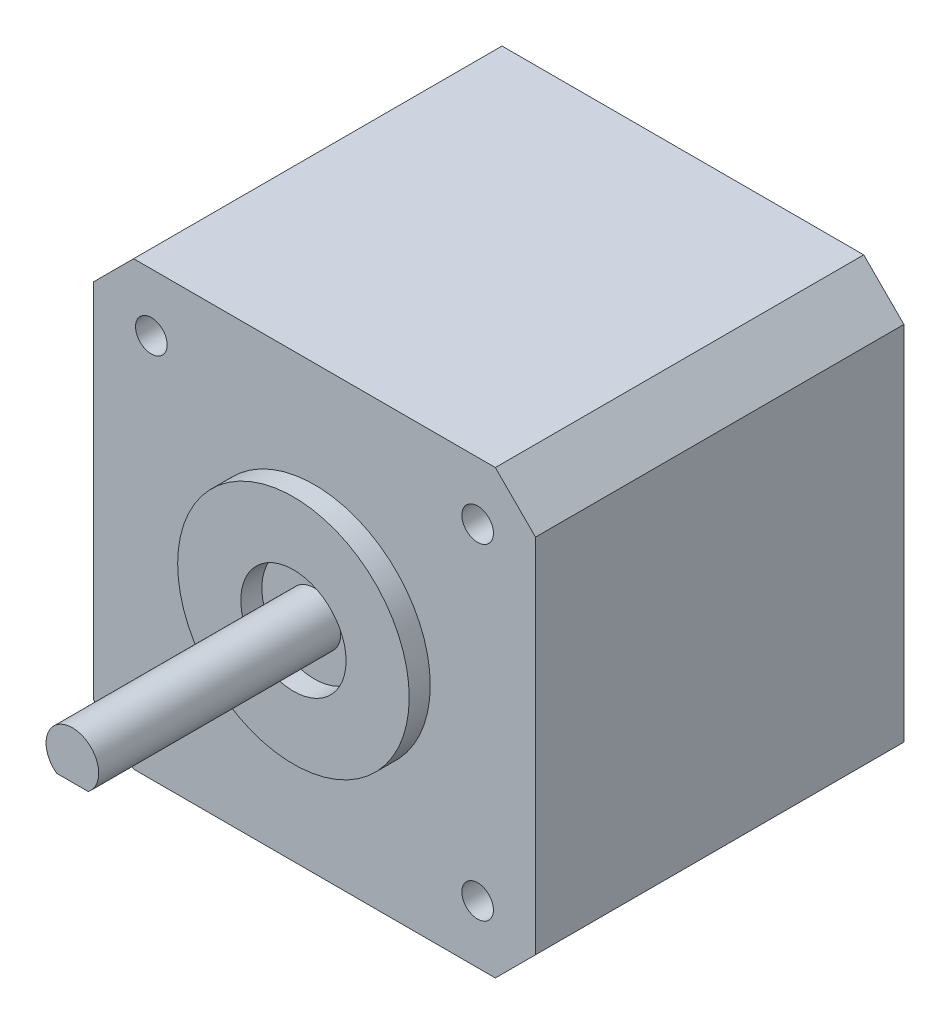
ISO-10303-21;
HEADER;
FILE_DESCRIPTION(('STEP AP214'),'2;1');
FILE_NAME('part.step','',(''),(''),'','','');
FILE_SCHEMA(('AUTOMOTIVE_DESIGN { 1 0 10303 214 1 1 1 1 }'));
ENDSEC;
DATA;
#1=APPLICATION_CONTEXT('core data for automotive mechanical design processes');
#2=APPLICATION_PROTOCOL_DEFINITION('international standard','automotive_design',2000,#1);
#3=PRODUCT_CONTEXT('',#1,'mechanical');
#4=PRODUCT('Part','Part','',(#3));
#5=PRODUCT_RELATED_PRODUCT_CATEGORY('part','',(#4));
#6=PRODUCT_DEFINITION_FORMATION('','',#4);
#7=PRODUCT_DEFINITION_CONTEXT('part definition',#1,'design');
#8=PRODUCT_DEFINITION('design','',#6,#7);
#9=PRODUCT_DEFINITION_SHAPE('','',#8);
#10=(LENGTH_UNIT() NAMED_UNIT(*) SI_UNIT(.MILLI.,.METRE.));
#11=(NAMED_UNIT(*) PLANE_ANGLE_UNIT() SI_UNIT($,.RADIAN.));
#12=(NAMED_UNIT(*) SI_UNIT($,.STERADIAN.) SOLID_ANGLE_UNIT());
#13=UNCERTAINTY_MEASURE_WITH_UNIT(LENGTH_MEASURE(1.E-05),#10,'distance_accuracy_value','');
#14=(GEOMETRIC_REPRESENTATION_CONTEXT(3) GLOBAL_UNCERTAINTY_ASSIGNED_CONTEXT((#13)) GLOBAL_UNIT_ASSIGNED_CONTEXT((#10,
#11,#12)) REPRESENTATION_CONTEXT('',''));
#15=CARTESIAN_POINT('',(0.,0.,0.));
#16=DIRECTION('',(0.,0.,1.));
#17=DIRECTION('',(1.,0.,0.));
#18=AXIS2_PLACEMENT_3D('',#15,#16,#17);
#19=CARTESIAN_POINT('',(21.,17.1837661840736,35.));
#20=DIRECTION('',(-0.70710678118655,-0.707106781186545,0.));
#21=DIRECTION('',(0.707106781186545,-0.70710678118655,0.));
#22=AXIS2_PLACEMENT_3D('',#19,#20,#21);
#23=PLANE('',#22);
#24=DIRECTION('',(-0.707106781186545,0.70710678118655,0.));
#25=VECTOR('',#24,1.);
#26=CARTESIAN_POINT('',(21.,17.1837661840736,0.));
#27=LINE('',#26,#25);
#28=CARTESIAN_POINT('',(21.,17.1837661840736,0.));
#29=VERTEX_POINT('',#28);
#30=CARTESIAN_POINT('',(17.1837661840736,21.,0.));
#31=VERTEX_POINT('',#30);
#32=EDGE_CURVE('E153',#29,#31,#27,.T.);
#33=ORIENTED_EDGE('',*,*,#32,.T.);
#34=DIRECTION('',(0.,0.,-1.));
#35=VECTOR('',#34,1.);
#36=CARTESIAN_POINT('',(17.1837661840736,21.,35.));
#37=LINE('',#36,#35);
#38=CARTESIAN_POINT('',(17.1837661840736,21.,35.));
#39=VERTEX_POINT('',#38);
#40=EDGE_CURVE('E196',#39,#31,#37,.T.);
#41=ORIENTED_EDGE('',*,*,#40,.F.);
#42=DIRECTION('',(-0.707106781186545,0.70710678118655,0.));
#43=VECTOR('',#42,1.);
#44=CARTESIAN_POINT('',(21.,17.1837661840736,35.));
#45=LINE('',#44,#43);
#46=CARTESIAN_POINT('',(21.,17.1837661840736,35.));
#47=VERTEX_POINT('',#46);
#48=EDGE_CURVE('E177',#47,#39,#45,.T.);
#49=ORIENTED_EDGE('',*,*,#48,.F.);
#50=DIRECTION('',(0.,0.,-1.));
#51=VECTOR('',#50,1.);
#52=CARTESIAN_POINT('',(21.,17.1837661840736,35.));
#53=LINE('',#52,#51);
#54=EDGE_CURVE('E149',#47,#29,#53,.T.);
#55=ORIENTED_EDGE('',*,*,#54,.T.);
#56=EDGE_LOOP('',(#33,#41,#49,#55));
#57=FACE_BOUND('',#56,.T.);
#58=ADVANCED_FACE('F39',(#57),#23,.F.);
#59=CARTESIAN_POINT('',(-17.1837661840736,21.,35.));
#60=DIRECTION('',(0.,-1.,0.));
#61=DIRECTION('',(1.,0.,0.));
#62=AXIS2_PLACEMENT_3D('',#59,#60,#61);
#63=PLANE('',#62);
#64=DIRECTION('',(-1.,0.,0.));
#65=VECTOR('',#64,1.);
#66=CARTESIAN_POINT('',(-17.1837661840736,21.,0.));
#67=LINE('',#66,#65);
#68=CARTESIAN_POINT('',(-17.1837661840736,21.,0.));
#69=VERTEX_POINT('',#68);
#70=EDGE_CURVE('E157',#31,#69,#67,.T.);
#71=ORIENTED_EDGE('',*,*,#70,.T.);
#72=DIRECTION('',(0.,0.,-1.));
#73=VECTOR('',#72,1.);
#74=CARTESIAN_POINT('',(-17.1837661840736,21.,35.));
#75=LINE('',#74,#73);
#76=CARTESIAN_POINT('',(-17.1837661840736,21.,35.));
#77=VERTEX_POINT('',#76);
#78=EDGE_CURVE('E192',#77,#69,#75,.T.);
#79=ORIENTED_EDGE('',*,*,#78,.F.);
#80=DIRECTION('',(-1.,0.,0.));
#81=VECTOR('',#80,1.);
#82=CARTESIAN_POINT('',(-17.1837661840736,21.,35.));
#83=LINE('',#82,#81);
#84=EDGE_CURVE('E105',#39,#77,#83,.T.);
#85=ORIENTED_EDGE('',*,*,#84,.F.);
#86=ORIENTED_EDGE('',*,*,#40,.T.);
#87=EDGE_LOOP('',(#71,#79,#85,#86));
#88=FACE_BOUND('',#87,.T.);
#89=ADVANCED_FACE('F228',(#88),#63,.F.);
#90=CARTESIAN_POINT('',(-21.,17.1837661840736,35.));
#91=DIRECTION('',(0.707106781186549,-0.707106781186546,0.));
#92=DIRECTION('',(0.707106781186546,0.707106781186549,0.));
#93=AXIS2_PLACEMENT_3D('',#90,#91,#92);
#94=PLANE('',#93);
#95=DIRECTION('',(-0.707106781186546,-0.707106781186549,0.));
#96=VECTOR('',#95,1.);
#97=CARTESIAN_POINT('',(-21.,17.1837661840736,0.));
#98=LINE('',#97,#96);
#99=CARTESIAN_POINT('',(-21.,17.1837661840736,0.));
#100=VERTEX_POINT('',#99);
#101=EDGE_CURVE('E161',#69,#100,#98,.T.);
#102=ORIENTED_EDGE('',*,*,#101,.T.);
#103=DIRECTION('',(0.,0.,-1.));
#104=VECTOR('',#103,1.);
#105=CARTESIAN_POINT('',(-21.,17.1837661840736,35.));
#106=LINE('',#105,#104);
#107=CARTESIAN_POINT('',(-21.,17.1837661840736,35.));
#108=VERTEX_POINT('',#107);
#109=EDGE_CURVE('E188',#108,#100,#106,.T.);
#110=ORIENTED_EDGE('',*,*,#109,.F.);
#111=DIRECTION('',(-0.707106781186546,-0.707106781186549,0.));
#112=VECTOR('',#111,1.);
#113=CARTESIAN_POINT('',(-21.,17.1837661840736,35.));
#114=LINE('',#113,#112);
#115=EDGE_CURVE('E242',#77,#108,#114,.T.);
#116=ORIENTED_EDGE('',*,*,#115,.F.);
#117=ORIENTED_EDGE('',*,*,#78,.T.);
#118=EDGE_LOOP('',(#102,#110,#116,#117));
#119=FACE_BOUND('',#118,.T.);
#120=ADVANCED_FACE('F233',(#119),#94,.F.);
#121=CARTESIAN_POINT('',(-21.,17.1837661840736,35.));
#122=DIRECTION('',(1.,0.,0.));
#123=DIRECTION('',(0.,1.,0.));
#124=AXIS2_PLACEMENT_3D('',#121,#122,#123);
#125=PLANE('',#124);
#126=DIRECTION('',(0.,-1.,0.));
#127=VECTOR('',#126,1.);
#128=CARTESIAN_POINT('',(-21.,17.1837661840736,0.));
#129=LINE('',#128,#127);
#130=CARTESIAN_POINT('',(-21.,-17.1837661840736,0.));
#131=VERTEX_POINT('',#130);
#132=EDGE_CURVE('E164',#100,#131,#129,.T.);
#133=ORIENTED_EDGE('',*,*,#132,.T.);
#134=DIRECTION('',(0.,0.,-1.));
#135=VECTOR('',#134,1.);
#136=CARTESIAN_POINT('',(-21.,-17.1837661840736,35.));
#137=LINE('',#136,#135);
#138=CARTESIAN_POINT('',(-21.,-17.1837661840736,35.));
#139=VERTEX_POINT('',#138);
#140=EDGE_CURVE('E184',#139,#131,#137,.T.);
#141=ORIENTED_EDGE('',*,*,#140,.F.);
#142=DIRECTION('',(0.,-1.,0.));
#143=VECTOR('',#142,1.);
#144=CARTESIAN_POINT('',(-21.,17.1837661840736,35.));
#145=LINE('',#144,#143);
#146=EDGE_CURVE('E245',#108,#139,#145,.T.);
#147=ORIENTED_EDGE('',*,*,#146,.F.);
#148=ORIENTED_EDGE('',*,*,#109,.T.);
#149=EDGE_LOOP('',(#133,#141,#147,#148));
#150=FACE_BOUND('',#149,.T.);
#151=ADVANCED_FACE('F520',(#150),#125,.F.);
#152=CARTESIAN_POINT('',(-17.1837661840736,-21.,35.));
#153=DIRECTION('',(0.707106781186548,0.707106781186548,0.));
#154=DIRECTION('',(-0.707106781186548,0.707106781186548,0.));
#155=AXIS2_PLACEMENT_3D('',#152,#153,#154);
#156=PLANE('',#155);
#157=DIRECTION('',(0.707106781186548,-0.707106781186548,0.));
#158=VECTOR('',#157,1.);
#159=CARTESIAN_POINT('',(-17.1837661840736,-21.,0.));
#160=LINE('',#159,#158);
#161=CARTESIAN_POINT('',(-17.1837661840736,-21.,0.));
#162=VERTEX_POINT('',#161);
#163=EDGE_CURVE('E167',#131,#162,#160,.T.);
#164=ORIENTED_EDGE('',*,*,#163,.T.);
#165=DIRECTION('',(0.,0.,-1.));
#166=VECTOR('',#165,1.);
#167=CARTESIAN_POINT('',(-17.1837661840736,-21.,35.));
#168=LINE('',#167,#166);
#169=CARTESIAN_POINT('',(-17.1837661840736,-21.,35.));
#170=VERTEX_POINT('',#169);
#171=EDGE_CURVE('E142',#170,#162,#168,.T.);
#172=ORIENTED_EDGE('',*,*,#171,.F.);
#173=DIRECTION('',(0.707106781186548,-0.707106781186548,0.));
#174=VECTOR('',#173,1.);
#175=CARTESIAN_POINT('',(-17.1837661840736,-21.,35.));
#176=LINE('',#175,#174);
#177=EDGE_CURVE('E128',#139,#170,#176,.T.);
#178=ORIENTED_EDGE('',*,*,#177,.F.);
#179=ORIENTED_EDGE('',*,*,#140,.T.);
#180=EDGE_LOOP('',(#164,#172,#178,#179));
#181=FACE_BOUND('',#180,.T.);
#182=ADVANCED_FACE('F512',(#181),#156,.F.);
#183=CARTESIAN_POINT('',(17.1837661840735,-21.,35.));
#184=DIRECTION('',(0.,1.,0.));
#185=DIRECTION('',(-1.,0.,0.));
#186=AXIS2_PLACEMENT_3D('',#183,#184,#185);
#187=PLANE('',#186);
#188=DIRECTION('',(1.,0.,0.));
#189=VECTOR('',#188,1.);
#190=CARTESIAN_POINT('',(17.1837661840735,-21.,0.));
#191=LINE('',#190,#189);
#192=CARTESIAN_POINT('',(17.1837661840735,-21.,0.));
#193=VERTEX_POINT('',#192);
#194=EDGE_CURVE('E138',#162,#193,#191,.T.);
#195=ORIENTED_EDGE('',*,*,#194,.T.);
#196=DIRECTION('',(0.,0.,-1.));
#197=VECTOR('',#196,1.);
#198=CARTESIAN_POINT('',(17.1837661840735,-21.,35.));
#199=LINE('',#198,#197);
#200=CARTESIAN_POINT('',(17.1837661840735,-21.,35.));
#201=VERTEX_POINT('',#200);
#202=EDGE_CURVE('E135',#201,#193,#199,.T.);
#203=ORIENTED_EDGE('',*,*,#202,.F.);
#204=DIRECTION('',(1.,0.,0.));
#205=VECTOR('',#204,1.);
#206=CARTESIAN_POINT('',(17.1837661840735,-21.,35.));
#207=LINE('',#206,#205);
#208=EDGE_CURVE('E121',#170,#201,#207,.T.);
#209=ORIENTED_EDGE('',*,*,#208,.F.);
#210=ORIENTED_EDGE('',*,*,#171,.T.);
#211=EDGE_LOOP('',(#195,#203,#209,#210));
#212=FACE_BOUND('',#211,.T.);
#213=ADVANCED_FACE('F136',(#212),#187,.F.);
#214=CARTESIAN_POINT('',(17.1837661840735,-21.,35.));
#215=DIRECTION('',(-0.707106781186546,0.707106781186549,0.));
#216=DIRECTION('',(-0.707106781186549,-0.707106781186546,0.));
#217=AXIS2_PLACEMENT_3D('',#214,#215,#216);
#218=PLANE('',#217);
#219=DIRECTION('',(0.707106781186549,0.707106781186546,0.));
#220=VECTOR('',#219,1.);
#221=CARTESIAN_POINT('',(17.1837661840735,-21.,0.));
#222=LINE('',#221,#220);
#223=CARTESIAN_POINT('',(21.,-17.1837661840735,0.));
#224=VERTEX_POINT('',#223);
#225=EDGE_CURVE('E172',#193,#224,#222,.T.);
#226=ORIENTED_EDGE('',*,*,#225,.T.);
#227=DIRECTION('',(0.,0.,-1.));
#228=VECTOR('',#227,1.);
#229=CARTESIAN_POINT('',(21.,-17.1837661840735,35.));
#230=LINE('',#229,#228);
#231=CARTESIAN_POINT('',(21.,-17.1837661840735,35.));
#232=VERTEX_POINT('',#231);
#233=EDGE_CURVE('E143',#232,#224,#230,.T.);
#234=ORIENTED_EDGE('',*,*,#233,.F.);
#235=DIRECTION('',(0.707106781186549,0.707106781186546,0.));
#236=VECTOR('',#235,1.);
#237=CARTESIAN_POINT('',(17.1837661840735,-21.,35.));
#238=LINE('',#237,#236);
#239=EDGE_CURVE('E125',#201,#232,#238,.T.);
#240=ORIENTED_EDGE('',*,*,#239,.F.);
#241=ORIENTED_EDGE('',*,*,#202,.T.);
#242=EDGE_LOOP('',(#226,#234,#240,#241));
#243=FACE_BOUND('',#242,.T.);
#244=ADVANCED_FACE('F145',(#243),#218,.F.);
#245=CARTESIAN_POINT('',(21.,-17.1837661840735,35.));
#246=DIRECTION('',(-1.,0.,0.));
#247=DIRECTION('',(0.,-1.,0.));
#248=AXIS2_PLACEMENT_3D('',#245,#246,#247);
#249=PLANE('',#248);
#250=DIRECTION('',(0.,1.,0.));
#251=VECTOR('',#250,1.);
#252=CARTESIAN_POINT('',(21.,-17.1837661840735,0.));
#253=LINE('',#252,#251);
#254=EDGE_CURVE('E96',#224,#29,#253,.T.);
#255=ORIENTED_EDGE('',*,*,#254,.T.);
#256=ORIENTED_EDGE('',*,*,#54,.F.);
#257=DIRECTION('',(0.,1.,0.));
#258=VECTOR('',#257,1.);
#259=CARTESIAN_POINT('',(21.,-17.1837661840735,35.));
#260=LINE('',#259,#258);
#261=EDGE_CURVE('E63',#232,#47,#260,.T.);
#262=ORIENTED_EDGE('',*,*,#261,.F.);
#263=ORIENTED_EDGE('',*,*,#233,.T.);
#264=EDGE_LOOP('',(#255,#256,#262,#263));
#265=FACE_BOUND('',#264,.T.);
#266=ADVANCED_FACE('F206',(#265),#249,.F.);
#267=CARTESIAN_POINT('',(0.,0.,35.));
#268=DIRECTION('',(0.,0.,-1.));
#269=DIRECTION('',(-1.,0.,0.));
#270=AXIS2_PLACEMENT_3D('',#267,#268,#269);
#271=PLANE('',#270);
#272=CARTESIAN_POINT('',(-15.4999999999991,-15.5,35.));
#273=DIRECTION('',(0.,0.,1.));
#274=DIRECTION('',(1.,0.,0.));
#275=AXIS2_PLACEMENT_3D('',#272,#273,#274);
#276=CIRCLE('',#275,1.50000000000046);
#277=CARTESIAN_POINT('',(-13.9999999999987,-15.5,35.));
#278=VERTEX_POINT('',#277);
#279=EDGE_CURVE('E296',#278,#278,#276,.T.);
#280=ORIENTED_EDGE('',*,*,#279,.F.);
#281=EDGE_LOOP('',(#280));
#282=FACE_BOUND('',#281,.T.);
#283=CARTESIAN_POINT('',(15.5000000000009,-15.4999999999991,35.));
#284=DIRECTION('',(0.,0.,1.));
#285=DIRECTION('',(1.,0.,0.));
#286=AXIS2_PLACEMENT_3D('',#283,#284,#285);
#287=CIRCLE('',#286,1.50000000000122);
#288=CARTESIAN_POINT('',(17.0000000000021,-15.4999999999991,35.));
#289=VERTEX_POINT('',#288);
#290=EDGE_CURVE('E304',#289,#289,#287,.T.);
#291=ORIENTED_EDGE('',*,*,#290,.F.);
#292=EDGE_LOOP('',(#291));
#293=FACE_BOUND('',#292,.T.);
#294=CARTESIAN_POINT('',(15.5,15.5000000000009,35.));
#295=DIRECTION('',(0.,0.,1.));
#296=DIRECTION('',(1.,0.,0.));
#297=AXIS2_PLACEMENT_3D('',#294,#295,#296);
#298=CIRCLE('',#297,1.5000000000009);
#299=CARTESIAN_POINT('',(17.0000000000009,15.5000000000009,35.));
#300=VERTEX_POINT('',#299);
#301=EDGE_CURVE('E312',#300,#300,#298,.T.);
#302=ORIENTED_EDGE('',*,*,#301,.F.);
#303=EDGE_LOOP('',(#302));
#304=FACE_BOUND('',#303,.T.);
#305=CARTESIAN_POINT('',(-15.5,15.5,35.));
#306=DIRECTION('',(0.,0.,1.));
#307=DIRECTION('',(1.,0.,0.));
#308=AXIS2_PLACEMENT_3D('',#305,#306,#307);
#309=CIRCLE('',#308,1.5);
#310=CARTESIAN_POINT('',(-14.,15.5,35.));
#311=VERTEX_POINT('',#310);
#312=EDGE_CURVE('E288',#311,#311,#309,.T.);
#313=ORIENTED_EDGE('',*,*,#312,.F.);
#314=EDGE_LOOP('',(#313));
#315=FACE_BOUND('',#314,.T.);
#316=CARTESIAN_POINT('',(0.,0.,35.));
#317=DIRECTION('',(0.,0.,-1.));
#318=DIRECTION('',(-1.,0.,0.));
#319=AXIS2_PLACEMENT_3D('',#316,#317,#318);
#320=CIRCLE('',#319,11.);
#321=CARTESIAN_POINT('',(-11.,0.,35.));
#322=VERTEX_POINT('',#321);
#323=EDGE_CURVE('E47',#322,#322,#320,.F.);
#324=ORIENTED_EDGE('',*,*,#323,.F.);
#325=EDGE_LOOP('',(#324));
#326=FACE_BOUND('',#325,.T.);
#327=ORIENTED_EDGE('',*,*,#48,.T.);
#328=ORIENTED_EDGE('',*,*,#84,.T.);
#329=ORIENTED_EDGE('',*,*,#115,.T.);
#330=ORIENTED_EDGE('',*,*,#146,.T.);
#331=ORIENTED_EDGE('',*,*,#177,.T.);
#332=ORIENTED_EDGE('',*,*,#208,.T.);
#333=ORIENTED_EDGE('',*,*,#239,.T.);
#334=ORIENTED_EDGE('',*,*,#261,.T.);
#335=EDGE_LOOP('',(#327,#328,#329,#330,#331,#332,#333,#334));
#336=FACE_BOUND('',#335,.T.);
#337=ADVANCED_FACE('F123',(#282,#293,#304,#315,#326,#336),#271,.F.);
#338=CARTESIAN_POINT('',(0.,0.,0.));
#339=DIRECTION('',(0.,0.,-1.));
#340=DIRECTION('',(-1.,0.,0.));
#341=AXIS2_PLACEMENT_3D('',#338,#339,#340);
#342=PLANE('',#341);
#343=ORIENTED_EDGE('',*,*,#32,.F.);
#344=ORIENTED_EDGE('',*,*,#254,.F.);
#345=ORIENTED_EDGE('',*,*,#225,.F.);
#346=ORIENTED_EDGE('',*,*,#194,.F.);
#347=ORIENTED_EDGE('',*,*,#163,.F.);
#348=ORIENTED_EDGE('',*,*,#132,.F.);
#349=ORIENTED_EDGE('',*,*,#101,.F.);
#350=ORIENTED_EDGE('',*,*,#70,.F.);
#351=EDGE_LOOP('',(#343,#344,#345,#346,#347,#348,#349,#350));
#352=FACE_BOUND('',#351,.T.);
#353=ADVANCED_FACE('F205',(#352),#342,.T.);
#354=CARTESIAN_POINT('',(0.,0.,37.));
#355=DIRECTION('',(0.,0.,1.));
#356=DIRECTION('',(1.,0.,0.));
#357=AXIS2_PLACEMENT_3D('',#354,#355,#356);
#358=PLANE('',#357);
#359=CARTESIAN_POINT('',(0.,0.,37.));
#360=DIRECTION('',(0.,0.,1.));
#361=DIRECTION('',(1.,0.,0.));
#362=AXIS2_PLACEMENT_3D('',#359,#360,#361);
#363=CIRCLE('',#362,11.);
#364=CARTESIAN_POINT('',(11.,0.,37.));
#365=VERTEX_POINT('',#364);
#366=EDGE_CURVE('E158',#365,#365,#363,.T.);
#367=ORIENTED_EDGE('',*,*,#366,.T.);
#368=EDGE_LOOP('',(#367));
#369=FACE_BOUND('',#368,.T.);
#370=CARTESIAN_POINT('',(0.,0.,37.));
#371=DIRECTION('',(0.,0.,1.));
#372=DIRECTION('',(1.,0.,0.));
#373=AXIS2_PLACEMENT_3D('',#370,#371,#372);
#374=CIRCLE('',#373,5.);
#375=CARTESIAN_POINT('',(5.,0.,37.));
#376=VERTEX_POINT('',#375);
#377=EDGE_CURVE('E258',#376,#376,#374,.T.);
#378=ORIENTED_EDGE('',*,*,#377,.F.);
#379=EDGE_LOOP('',(#378));
#380=FACE_BOUND('',#379,.T.);
#381=ADVANCED_FACE('F215',(#369,#380),#358,.T.);
#382=CARTESIAN_POINT('',(0.,0.,37.));
#383=DIRECTION('',(0.,0.,-1.));
#384=DIRECTION('',(-1.,0.,0.));
#385=AXIS2_PLACEMENT_3D('',#382,#383,#384);
#386=CYLINDRICAL_SURFACE('',#385,11.);
#387=ORIENTED_EDGE('',*,*,#366,.F.);
#388=EDGE_LOOP('',(#387));
#389=FACE_BOUND('',#388,.T.);
#390=ORIENTED_EDGE('',*,*,#323,.T.);
#391=EDGE_LOOP('',(#390));
#392=FACE_BOUND('',#391,.T.);
#393=ADVANCED_FACE('F202',(#389,#392),#386,.T.);
#394=CARTESIAN_POINT('',(0.,0.,37.));
#395=DIRECTION('',(0.,0.,-1.));
#396=DIRECTION('',(-1.,0.,0.));
#397=AXIS2_PLACEMENT_3D('',#394,#395,#396);
#398=CYLINDRICAL_SURFACE('',#397,5.);
#399=ORIENTED_EDGE('',*,*,#377,.T.);
#400=EDGE_LOOP('',(#399));
#401=FACE_BOUND('',#400,.T.);
#402=CARTESIAN_POINT('',(0.,0.,35.));
#403=DIRECTION('',(0.,0.,1.));
#404=DIRECTION('',(1.,0.,0.));
#405=AXIS2_PLACEMENT_3D('',#402,#403,#404);
#406=CIRCLE('',#405,5.);
#407=CARTESIAN_POINT('',(5.,0.,35.));
#408=VERTEX_POINT('',#407);
#409=EDGE_CURVE('E259',#408,#408,#406,.T.);
#410=ORIENTED_EDGE('',*,*,#409,.F.);
#411=EDGE_LOOP('',(#410));
#412=FACE_BOUND('',#411,.T.);
#413=ADVANCED_FACE('F225',(#401,#412),#398,.F.);
#414=CARTESIAN_POINT('',(0.,0.,35.));
#415=DIRECTION('',(0.,0.,-1.));
#416=DIRECTION('',(-1.,0.,0.));
#417=AXIS2_PLACEMENT_3D('',#414,#415,#416);
#418=CIRCLE('',#417,2.5);
#419=CARTESIAN_POINT('',(-2.5,0.,35.));
#420=VERTEX_POINT('',#419);
#421=EDGE_CURVE('E11',#420,#420,#418,.F.);
#422=ORIENTED_EDGE('',*,*,#421,.F.);
#423=EDGE_LOOP('',(#422));
#424=FACE_BOUND('',#423,.T.);
#425=ORIENTED_EDGE('',*,*,#409,.T.);
#426=EDGE_LOOP('',(#425));
#427=FACE_BOUND('',#426,.T.);
#428=ADVANCED_FACE('F209',(#424,#427),#271,.F.);
#429=CARTESIAN_POINT('',(0.,0.,58.));
#430=DIRECTION('',(0.,0.,-1.));
#431=DIRECTION('',(-1.,0.,0.));
#432=AXIS2_PLACEMENT_3D('',#429,#430,#431);
#433=CYLINDRICAL_SURFACE('',#432,2.5);
#434=CARTESIAN_POINT('',(0.,0.,58.));
#435=DIRECTION('',(0.,0.,1.));
#436=DIRECTION('',(1.,0.,0.));
#437=AXIS2_PLACEMENT_3D('',#434,#435,#436);
#438=CIRCLE('',#437,2.5);
#439=CARTESIAN_POINT('',(1.5,-2.,58.));
#440=VERTEX_POINT('',#439);
#441=CARTESIAN_POINT('',(-1.5,-2.,58.));
#442=VERTEX_POINT('',#441);
#443=EDGE_CURVE('E263',#440,#442,#438,.T.);
#444=ORIENTED_EDGE('',*,*,#443,.F.);
#445=DIRECTION('',(0.,0.,1.));
#446=VECTOR('',#445,1.);
#447=CARTESIAN_POINT('',(1.5,-2.,40.));
#448=LINE('',#447,#446);
#449=CARTESIAN_POINT('',(1.5,-2.,40.));
#450=VERTEX_POINT('',#449);
#451=EDGE_CURVE('E54',#450,#440,#448,.T.);
#452=ORIENTED_EDGE('',*,*,#451,.F.);
#453=CARTESIAN_POINT('',(0.,0.,40.));
#454=DIRECTION('',(0.,0.,1.));
#455=DIRECTION('',(1.,0.,0.));
#456=AXIS2_PLACEMENT_3D('',#453,#454,#455);
#457=CIRCLE('',#456,2.5);
#458=CARTESIAN_POINT('',(-1.5,-2.,40.));
#459=VERTEX_POINT('',#458);
#460=EDGE_CURVE('E280',#459,#450,#457,.T.);
#461=ORIENTED_EDGE('',*,*,#460,.F.);
#462=DIRECTION('',(0.,0.,1.));
#463=VECTOR('',#462,1.);
#464=CARTESIAN_POINT('',(-1.5,-2.,40.));
#465=LINE('',#464,#463);
#466=EDGE_CURVE('E270',#459,#442,#465,.T.);
#467=ORIENTED_EDGE('',*,*,#466,.T.);
#468=EDGE_LOOP('',(#444,#452,#461,#467));
#469=FACE_BOUND('',#468,.T.);
#470=ORIENTED_EDGE('',*,*,#421,.T.);
#471=EDGE_LOOP('',(#470));
#472=FACE_BOUND('',#471,.T.);
#473=ADVANCED_FACE('F224',(#469,#472),#433,.T.);
#474=CARTESIAN_POINT('',(0.,0.,58.));
#475=DIRECTION('',(0.,0.,1.));
#476=DIRECTION('',(1.,0.,0.));
#477=AXIS2_PLACEMENT_3D('',#474,#475,#476);
#478=PLANE('',#477);
#479=DIRECTION('',(-1.,0.,0.));
#480=VECTOR('',#479,1.);
#481=CARTESIAN_POINT('',(1.5,-2.,58.));
#482=LINE('',#481,#480);
#483=EDGE_CURVE('E277',#440,#442,#482,.T.);
#484=ORIENTED_EDGE('',*,*,#483,.F.);
#485=ORIENTED_EDGE('',*,*,#443,.T.);
#486=EDGE_LOOP('',(#484,#485));
#487=FACE_BOUND('',#486,.T.);
#488=ADVANCED_FACE('F350',(#487),#478,.T.);
#489=CARTESIAN_POINT('',(1.5,-2.,40.));
#490=DIRECTION('',(0.,1.,0.));
#491=DIRECTION('',(0.,0.,1.));
#492=AXIS2_PLACEMENT_3D('',#489,#490,#491);
#493=PLANE('',#492);
#494=ORIENTED_EDGE('',*,*,#483,.T.);
#495=ORIENTED_EDGE('',*,*,#466,.F.);
#496=DIRECTION('',(-1.,0.,0.));
#497=VECTOR('',#496,1.);
#498=CARTESIAN_POINT('',(1.5,-2.,40.));
#499=LINE('',#498,#497);
#500=EDGE_CURVE('E273',#450,#459,#499,.T.);
#501=ORIENTED_EDGE('',*,*,#500,.F.);
#502=ORIENTED_EDGE('',*,*,#451,.T.);
#503=EDGE_LOOP('',(#494,#495,#501,#502));
#504=FACE_BOUND('',#503,.T.);
#505=ADVANCED_FACE('F342',(#504),#493,.F.);
#506=CARTESIAN_POINT('',(0.,0.,40.));
#507=DIRECTION('',(0.,0.,1.));
#508=DIRECTION('',(1.,0.,0.));
#509=AXIS2_PLACEMENT_3D('',#506,#507,#508);
#510=PLANE('',#509);
#511=ORIENTED_EDGE('',*,*,#460,.T.);
#512=ORIENTED_EDGE('',*,*,#500,.T.);
#513=EDGE_LOOP('',(#511,#512));
#514=FACE_BOUND('',#513,.T.);
#515=ADVANCED_FACE('F334',(#514),#510,.T.);
#516=CARTESIAN_POINT('',(-15.5,15.5,30.));
#517=DIRECTION('',(0.,0.,1.));
#518=DIRECTION('',(1.,0.,0.));
#519=AXIS2_PLACEMENT_3D('',#516,#517,#518);
#520=CYLINDRICAL_SURFACE('',#519,1.5);
#521=CARTESIAN_POINT('',(-15.5,15.5,30.));
#522=DIRECTION('',(0.,0.,1.));
#523=DIRECTION('',(1.,0.,0.));
#524=AXIS2_PLACEMENT_3D('',#521,#522,#523);
#525=CIRCLE('',#524,1.5);
#526=CARTESIAN_POINT('',(-14.,15.5,30.));
#527=VERTEX_POINT('',#526);
#528=EDGE_CURVE('E281',#527,#527,#525,.T.);
#529=ORIENTED_EDGE('',*,*,#528,.F.);
#530=EDGE_LOOP('',(#529));
#531=FACE_BOUND('',#530,.T.);
#532=ORIENTED_EDGE('',*,*,#312,.T.);
#533=EDGE_LOOP('',(#532));
#534=FACE_BOUND('',#533,.T.);
#535=ADVANCED_FACE('F332',(#531,#534),#520,.F.);
#536=CARTESIAN_POINT('',(-15.5,15.5,30.));
#537=DIRECTION('',(0.,0.,1.));
#538=DIRECTION('',(1.,0.,0.));
#539=AXIS2_PLACEMENT_3D('',#536,#537,#538);
#540=PLANE('',#539);
#541=ORIENTED_EDGE('',*,*,#528,.T.);
#542=EDGE_LOOP('',(#541));
#543=FACE_BOUND('',#542,.T.);
#544=ADVANCED_FACE('F325',(#543),#540,.T.);
#545=CARTESIAN_POINT('',(15.5,15.5000000000009,30.));
#546=DIRECTION('',(0.,0.,1.));
#547=DIRECTION('',(1.,0.,0.));
#548=AXIS2_PLACEMENT_3D('',#545,#546,#547);
#549=CYLINDRICAL_SURFACE('',#548,1.5000000000009);
#550=CARTESIAN_POINT('',(15.5,15.5000000000009,30.));
#551=DIRECTION('',(0.,0.,1.));
#552=DIRECTION('',(1.,0.,0.));
#553=AXIS2_PLACEMENT_3D('',#550,#551,#552);
#554=CIRCLE('',#553,1.5000000000009);
#555=CARTESIAN_POINT('',(17.0000000000009,15.5000000000009,30.));
#556=VERTEX_POINT('',#555);
#557=EDGE_CURVE('E292',#556,#556,#554,.T.);
#558=ORIENTED_EDGE('',*,*,#557,.F.);
#559=EDGE_LOOP('',(#558));
#560=FACE_BOUND('',#559,.T.);
#561=ORIENTED_EDGE('',*,*,#301,.T.);
#562=EDGE_LOOP('',(#561));
#563=FACE_BOUND('',#562,.T.);
#564=ADVANCED_FACE('F322',(#560,#563),#549,.F.);
#565=CARTESIAN_POINT('',(15.5,15.5000000000009,30.));
#566=DIRECTION('',(0.,0.,1.));
#567=DIRECTION('',(1.,0.,0.));
#568=AXIS2_PLACEMENT_3D('',#565,#566,#567);
#569=PLANE('',#568);
#570=ORIENTED_EDGE('',*,*,#557,.T.);
#571=EDGE_LOOP('',(#570));
#572=FACE_BOUND('',#571,.T.);
#573=ADVANCED_FACE('F320',(#572),#569,.T.);
#574=CARTESIAN_POINT('',(15.5000000000009,-15.4999999999991,30.));
#575=DIRECTION('',(0.,0.,1.));
#576=DIRECTION('',(1.,0.,0.));
#577=AXIS2_PLACEMENT_3D('',#574,#575,#576);
#578=CYLINDRICAL_SURFACE('',#577,1.50000000000122);
#579=CARTESIAN_POINT('',(15.5000000000009,-15.4999999999991,30.));
#580=DIRECTION('',(0.,0.,1.));
#581=DIRECTION('',(1.,0.,0.));
#582=AXIS2_PLACEMENT_3D('',#579,#580,#581);
#583=CIRCLE('',#582,1.50000000000122);
#584=CARTESIAN_POINT('',(17.0000000000021,-15.4999999999991,30.));
#585=VERTEX_POINT('',#584);
#586=EDGE_CURVE('E308',#585,#585,#583,.T.);
#587=ORIENTED_EDGE('',*,*,#586,.F.);
#588=EDGE_LOOP('',(#587));
#589=FACE_BOUND('',#588,.T.);
#590=ORIENTED_EDGE('',*,*,#290,.T.);
#591=EDGE_LOOP('',(#590));
#592=FACE_BOUND('',#591,.T.);
#593=ADVANCED_FACE('F420',(#589,#592),#578,.F.);
#594=CARTESIAN_POINT('',(15.5000000000009,-15.4999999999991,30.));
#595=DIRECTION('',(0.,0.,1.));
#596=DIRECTION('',(1.,0.,0.));
#597=AXIS2_PLACEMENT_3D('',#594,#595,#596);
#598=PLANE('',#597);
#599=ORIENTED_EDGE('',*,*,#586,.T.);
#600=EDGE_LOOP('',(#599));
#601=FACE_BOUND('',#600,.T.);
#602=ADVANCED_FACE('F428',(#601),#598,.T.);
#603=CARTESIAN_POINT('',(-15.4999999999991,-15.5,30.));
#604=DIRECTION('',(0.,0.,1.));
#605=DIRECTION('',(1.,0.,0.));
#606=AXIS2_PLACEMENT_3D('',#603,#604,#605);
#607=CYLINDRICAL_SURFACE('',#606,1.50000000000046);
#608=CARTESIAN_POINT('',(-15.4999999999991,-15.5,30.));
#609=DIRECTION('',(0.,0.,1.));
#610=DIRECTION('',(1.,0.,0.));
#611=AXIS2_PLACEMENT_3D('',#608,#609,#610);
#612=CIRCLE('',#611,1.50000000000046);
#613=CARTESIAN_POINT('',(-13.9999999999987,-15.5,30.));
#614=VERTEX_POINT('',#613);
#615=EDGE_CURVE('E300',#614,#614,#612,.T.);
#616=ORIENTED_EDGE('',*,*,#615,.F.);
#617=EDGE_LOOP('',(#616));
#618=FACE_BOUND('',#617,.T.);
#619=ORIENTED_EDGE('',*,*,#279,.T.);
#620=EDGE_LOOP('',(#619));
#621=FACE_BOUND('',#620,.T.);
#622=ADVANCED_FACE('F437',(#618,#621),#607,.F.);
#623=CARTESIAN_POINT('',(-15.4999999999991,-15.5,30.));
#624=DIRECTION('',(0.,0.,1.));
#625=DIRECTION('',(1.,0.,0.));
#626=AXIS2_PLACEMENT_3D('',#623,#624,#625);
#627=PLANE('',#626);
#628=ORIENTED_EDGE('',*,*,#615,.T.);
#629=EDGE_LOOP('',(#628));
#630=FACE_BOUND('',#629,.T.);
#631=ADVANCED_FACE('F446',(#630),#627,.T.);
#632=CLOSED_SHELL('',(#58,#89,#120,#151,#182,#213,#244,#266,#337,#353,#381,#393,#413,#428,#473,
#488,#505,#515,#535,#544,#564,#573,#593,#602,#622,#631));
#633=MANIFOLD_SOLID_BREP('B2',#632);
#634=ADVANCED_BREP_SHAPE_REPRESENTATION('',(#18,#633),#14);
#635=SHAPE_DEFINITION_REPRESENTATION(#9,#634);
ENDSEC;
END-ISO-10303-21;
